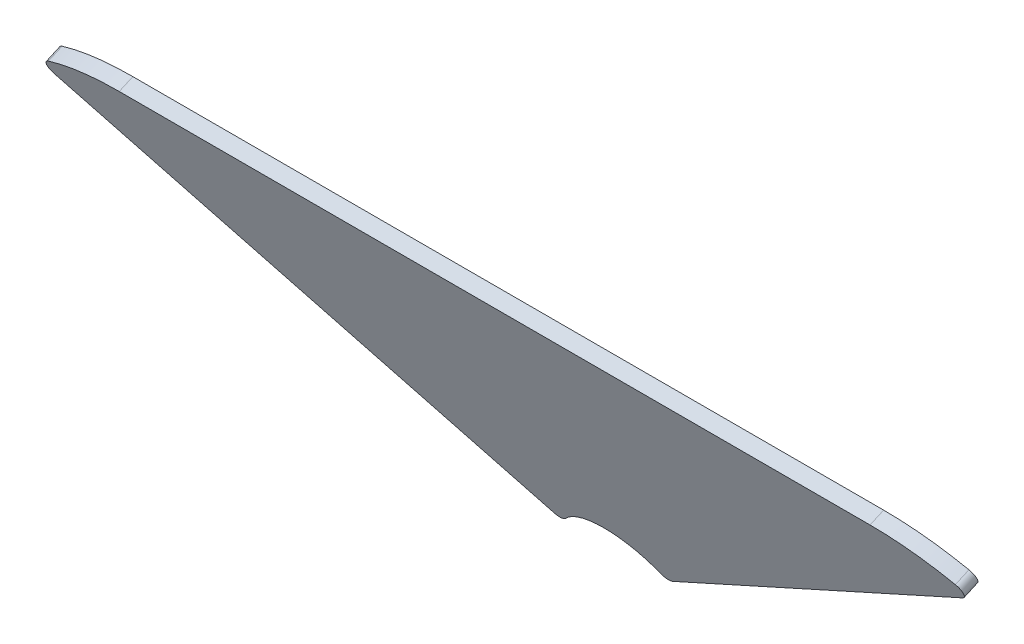
ISO-10303-21;
HEADER;
FILE_DESCRIPTION(('STEP AP214'),'2;1');
FILE_NAME('part.step','',(''),(''),'','','');
FILE_SCHEMA(('AUTOMOTIVE_DESIGN { 1 0 10303 214 1 1 1 1 }'));
ENDSEC;
DATA;
#1=APPLICATION_CONTEXT('core data for automotive mechanical design processes');
#2=APPLICATION_PROTOCOL_DEFINITION('international standard','automotive_design',2000,#1);
#3=PRODUCT_CONTEXT('',#1,'mechanical');
#4=PRODUCT('Part','Part','',(#3));
#5=PRODUCT_RELATED_PRODUCT_CATEGORY('part','',(#4));
#6=PRODUCT_DEFINITION_FORMATION('','',#4);
#7=PRODUCT_DEFINITION_CONTEXT('part definition',#1,'design');
#8=PRODUCT_DEFINITION('design','',#6,#7);
#9=PRODUCT_DEFINITION_SHAPE('','',#8);
#10=(LENGTH_UNIT() NAMED_UNIT(*) SI_UNIT(.MILLI.,.METRE.));
#11=(NAMED_UNIT(*) PLANE_ANGLE_UNIT() SI_UNIT($,.RADIAN.));
#12=(NAMED_UNIT(*) SI_UNIT($,.STERADIAN.) SOLID_ANGLE_UNIT());
#13=UNCERTAINTY_MEASURE_WITH_UNIT(LENGTH_MEASURE(1.E-05),#10,'distance_accuracy_value','');
#14=(GEOMETRIC_REPRESENTATION_CONTEXT(3) GLOBAL_UNCERTAINTY_ASSIGNED_CONTEXT((#13)) GLOBAL_UNIT_ASSIGNED_CONTEXT((#10,
#11,#12)) REPRESENTATION_CONTEXT('',''));
#15=CARTESIAN_POINT('',(0.,0.,0.));
#16=DIRECTION('',(0.,0.,1.));
#17=DIRECTION('',(1.,0.,0.));
#18=AXIS2_PLACEMENT_3D('',#15,#16,#17);
#19=CARTESIAN_POINT('',(648.976759705314,817.463497919613,1215.15601855206));
#20=DIRECTION('',(0.,-0.407574775249865,0.913171836282757));
#21=DIRECTION('',(0.,-0.913171836282757,-0.407574775249865));
#22=AXIS2_PLACEMENT_3D('',#19,#20,#21);
#23=CYLINDRICAL_SURFACE('',#22,26.5523634746972);
#24=CARTESIAN_POINT('',(648.976759705314,817.463497919613,1215.15601855206));
#25=DIRECTION('',(0.,-0.407574775249865,0.913171836282757));
#26=DIRECTION('',(0.,0.913171836282757,0.407574775249865));
#27=AXIS2_PLACEMENT_3D('',#24,#25,#26);
#28=CIRCLE('',#27,26.5523634746972);
#29=CARTESIAN_POINT('',(669.202994390904,833.172374395633,1222.16734056699));
#30=VERTEX_POINT('',#29);
#31=CARTESIAN_POINT('',(628.750535488322,833.172385635552,1222.16734558369));
#32=VERTEX_POINT('',#31);
#33=EDGE_CURVE('E176',#30,#32,#28,.T.);
#34=ORIENTED_EDGE('',*,*,#33,.F.);
#35=DIRECTION('',(0.,-0.407574775249865,0.913171836282757));
#36=VECTOR('',#35,1.);
#37=CARTESIAN_POINT('',(669.202994390904,833.172374395633,1222.16734056699));
#38=LINE('',#37,#36);
#39=CARTESIAN_POINT('',(669.202994390904,830.584274572796,1227.96598172738));
#40=VERTEX_POINT('',#39);
#41=EDGE_CURVE('E181',#30,#40,#38,.T.);
#42=ORIENTED_EDGE('',*,*,#41,.T.);
#43=CARTESIAN_POINT('',(648.976759705314,814.875398096777,1220.95465971245));
#44=DIRECTION('',(0.,-0.407574775249865,0.913171836282757));
#45=DIRECTION('',(0.,0.913171836282757,0.407574775249865));
#46=AXIS2_PLACEMENT_3D('',#43,#44,#45);
#47=CIRCLE('',#46,26.5523634746972);
#48=CARTESIAN_POINT('',(628.750535488322,830.584285812715,1227.96598674408));
#49=VERTEX_POINT('',#48);
#50=EDGE_CURVE('E156',#40,#49,#47,.T.);
#51=ORIENTED_EDGE('',*,*,#50,.T.);
#52=DIRECTION('',(0.,-0.407574775249865,0.913171836282757));
#53=VECTOR('',#52,1.);
#54=CARTESIAN_POINT('',(628.750535488322,833.172385635552,1222.16734558369));
#55=LINE('',#54,#53);
#56=EDGE_CURVE('E141',#49,#32,#55,.F.);
#57=ORIENTED_EDGE('',*,*,#56,.T.);
#58=EDGE_LOOP('',(#34,#42,#51,#57));
#59=FACE_BOUND('',#58,.T.);
#60=ADVANCED_FACE('F44',(#59),#23,.F.);
#61=CARTESIAN_POINT('',(462.372119344804,928.855167936901,1264.87331497769));
#62=DIRECTION('',(0.547162835676885,0.764348736670399,0.341150758469618));
#63=DIRECTION('',(-0.813129518351622,0.582082800282966,0.));
#64=AXIS2_PLACEMENT_3D('',#61,#62,#63);
#65=PLANE('',#64);
#66=DIRECTION('',(-0.83702618313529,0.49965369140074,0.223009769776085));
#67=VECTOR('',#66,1.);
#68=CARTESIAN_POINT('',(626.751764414209,830.730523684528,1221.07747257585));
#69=LINE('',#68,#67);
#70=CARTESIAN_POINT('',(623.763583131698,832.514286054767,1221.87361687013));
#71=VERTEX_POINT('',#70);
#72=CARTESIAN_POINT('',(455.1698421272,933.154489117976,1266.79222530155));
#73=VERTEX_POINT('',#72);
#74=EDGE_CURVE('E131',#71,#73,#69,.T.);
#75=ORIENTED_EDGE('',*,*,#74,.F.);
#76=DIRECTION('',(0.,-0.407574775249865,0.913171836282757));
#77=VECTOR('',#76,1.);
#78=CARTESIAN_POINT('',(623.763583131698,832.514286054767,1221.87361687013));
#79=LINE('',#78,#77);
#80=CARTESIAN_POINT('',(623.763583131698,829.92618623193,1227.67225803052));
#81=VERTEX_POINT('',#80);
#82=EDGE_CURVE('E218',#71,#81,#79,.T.);
#83=ORIENTED_EDGE('',*,*,#82,.T.);
#84=DIRECTION('',(-0.837026183135289,0.499653691400742,0.223009769776083));
#85=VECTOR('',#84,1.);
#86=CARTESIAN_POINT('',(462.372119344804,926.267068114065,1270.67195613808));
#87=LINE('',#86,#85);
#88=CARTESIAN_POINT('',(455.1698421272,930.566389295139,1272.59086646194));
#89=VERTEX_POINT('',#88);
#90=EDGE_CURVE('E160',#81,#89,#87,.T.);
#91=ORIENTED_EDGE('',*,*,#90,.T.);
#92=DIRECTION('',(0.,-0.407574775249865,0.913171836282757));
#93=VECTOR('',#92,1.);
#94=CARTESIAN_POINT('',(455.1698421272,933.154489117976,1266.79222530155));
#95=LINE('',#94,#93);
#96=EDGE_CURVE('E215',#89,#73,#95,.F.);
#97=ORIENTED_EDGE('',*,*,#96,.T.);
#98=EDGE_LOOP('',(#75,#83,#91,#97));
#99=FACE_BOUND('',#98,.T.);
#100=ADVANCED_FACE('F254',(#99),#65,.F.);
#101=CARTESIAN_POINT('',(488.877633309184,876.219137175357,1241.38034513861));
#102=DIRECTION('',(0.,-0.407574775249865,0.913171836282757));
#103=DIRECTION('',(0.,-0.913171836282757,-0.407574775249865));
#104=AXIS2_PLACEMENT_3D('',#101,#102,#103);
#105=CYLINDRICAL_SURFACE('',#104,76.5785320140082);
#106=CARTESIAN_POINT('',(488.877633309184,876.219137175357,1241.38034513861));
#107=DIRECTION('',(0.,0.407574775249865,-0.913171836282757));
#108=DIRECTION('',(0.,-0.913171836282757,-0.407574775249865));
#109=AXIS2_PLACEMENT_3D('',#106,#107,#108);
#110=CIRCLE('',#109,76.5785320140082);
#111=CARTESIAN_POINT('',(455.598816651891,939.200142118402,1269.49057359152));
#112=VERTEX_POINT('',#111);
#113=CARTESIAN_POINT('',(488.877633309184,946.148495874427,1272.59182311319));
#114=VERTEX_POINT('',#113);
#115=EDGE_CURVE('E120',#112,#114,#110,.T.);
#116=ORIENTED_EDGE('',*,*,#115,.F.);
#117=DIRECTION('',(0.,-0.407574775249865,0.913171836282757));
#118=VECTOR('',#117,1.);
#119=CARTESIAN_POINT('',(455.598816651891,939.200142118402,1269.49057359152));
#120=LINE('',#119,#118);
#121=CARTESIAN_POINT('',(455.598816651891,936.612042295566,1275.28921475192));
#122=VERTEX_POINT('',#121);
#123=EDGE_CURVE('E53',#112,#122,#120,.T.);
#124=ORIENTED_EDGE('',*,*,#123,.T.);
#125=CARTESIAN_POINT('',(488.877633309184,873.63103735252,1247.17898629901));
#126=DIRECTION('',(0.,0.407574775249865,-0.913171836282757));
#127=DIRECTION('',(0.,-0.913171836282757,-0.407574775249865));
#128=AXIS2_PLACEMENT_3D('',#125,#126,#127);
#129=CIRCLE('',#128,76.5785320140082);
#130=CARTESIAN_POINT('',(488.877633309184,943.56039605159,1278.39046427358));
#131=VERTEX_POINT('',#130);
#132=EDGE_CURVE('E137',#122,#131,#129,.T.);
#133=ORIENTED_EDGE('',*,*,#132,.T.);
#134=DIRECTION('',(0.,-0.407574775249865,0.913171836282757));
#135=VECTOR('',#134,1.);
#136=CARTESIAN_POINT('',(488.877633309184,946.148495874427,1272.59182311319));
#137=LINE('',#136,#135);
#138=EDGE_CURVE('E134',#114,#131,#137,.T.);
#139=ORIENTED_EDGE('',*,*,#138,.F.);
#140=EDGE_LOOP('',(#116,#124,#133,#139));
#141=FACE_BOUND('',#140,.T.);
#142=ADVANCED_FACE('F135',(#141),#105,.T.);
#143=CARTESIAN_POINT('',(488.877633309184,946.148495874427,1272.59182311319));
#144=DIRECTION('',(0.,-0.913171836282757,-0.407574775249865));
#145=DIRECTION('',(0.,0.407574775249865,-0.913171836282757));
#146=AXIS2_PLACEMENT_3D('',#143,#144,#145);
#147=PLANE('',#146);
#148=DIRECTION('',(1.,0.,0.));
#149=VECTOR('',#148,1.);
#150=CARTESIAN_POINT('',(488.877633309184,943.56039605159,1278.39046427358));
#151=LINE('',#150,#149);
#152=CARTESIAN_POINT('',(809.076030052897,943.56039605159,1278.39046427358));
#153=VERTEX_POINT('',#152);
#154=EDGE_CURVE('E166',#131,#153,#151,.T.);
#155=ORIENTED_EDGE('',*,*,#154,.T.);
#156=DIRECTION('',(0.,-0.407574775249865,0.913171836282757));
#157=VECTOR('',#156,1.);
#158=CARTESIAN_POINT('',(809.076030052897,946.148495874427,1272.59182311319));
#159=LINE('',#158,#157);
#160=CARTESIAN_POINT('',(809.076030052897,946.148495874427,1272.59182311319));
#161=VERTEX_POINT('',#160);
#162=EDGE_CURVE('E142',#161,#153,#159,.T.);
#163=ORIENTED_EDGE('',*,*,#162,.F.);
#164=DIRECTION('',(1.,0.,0.));
#165=VECTOR('',#164,1.);
#166=CARTESIAN_POINT('',(488.877633309184,946.148495874427,1272.59182311319));
#167=LINE('',#166,#165);
#168=EDGE_CURVE('E125',#114,#161,#167,.T.);
#169=ORIENTED_EDGE('',*,*,#168,.F.);
#170=ORIENTED_EDGE('',*,*,#138,.T.);
#171=EDGE_LOOP('',(#155,#163,#169,#170));
#172=FACE_BOUND('',#171,.T.);
#173=ADVANCED_FACE('F144',(#172),#147,.F.);
#174=CARTESIAN_POINT('',(809.076030052897,876.217572779631,1241.37964690394));
#175=DIRECTION('',(0.,-0.407574775249865,0.913171836282757));
#176=DIRECTION('',(0.,-0.913171836282757,-0.407574775249865));
#177=AXIS2_PLACEMENT_3D('',#174,#175,#176);
#178=CYLINDRICAL_SURFACE('',#177,76.5802451589646);
#179=CARTESIAN_POINT('',(809.076030052897,873.629472956795,1247.17828806434));
#180=DIRECTION('',(0.,0.407574775249865,-0.913171836282757));
#181=DIRECTION('',(0.,0.913171836282757,0.407574775249865));
#182=AXIS2_PLACEMENT_3D('',#179,#180,#181);
#183=CIRCLE('',#182,76.5802451589646);
#184=CARTESIAN_POINT('',(842.354985766223,936.612153613154,1275.28926443615));
#185=VERTEX_POINT('',#184);
#186=EDGE_CURVE('E169',#153,#185,#183,.T.);
#187=ORIENTED_EDGE('',*,*,#186,.T.);
#188=DIRECTION('',(0.,-0.407574775249865,0.913171836282757));
#189=VECTOR('',#188,1.);
#190=CARTESIAN_POINT('',(842.354985766223,939.200253435991,1269.49062327576));
#191=LINE('',#190,#189);
#192=CARTESIAN_POINT('',(842.354985766223,939.200253435991,1269.49062327576));
#193=VERTEX_POINT('',#192);
#194=EDGE_CURVE('E11',#185,#193,#191,.F.);
#195=ORIENTED_EDGE('',*,*,#194,.T.);
#196=CARTESIAN_POINT('',(809.076030052897,876.217572779631,1241.37964690394));
#197=DIRECTION('',(0.,0.407574775249865,-0.913171836282757));
#198=DIRECTION('',(0.,0.913171836282757,0.407574775249865));
#199=AXIS2_PLACEMENT_3D('',#196,#197,#198);
#200=CIRCLE('',#199,76.5802451589646);
#201=EDGE_CURVE('E147',#161,#193,#200,.T.);
#202=ORIENTED_EDGE('',*,*,#201,.F.);
#203=ORIENTED_EDGE('',*,*,#162,.T.);
#204=EDGE_LOOP('',(#187,#195,#202,#203));
#205=FACE_BOUND('',#204,.T.);
#206=ADVANCED_FACE('F228',(#205),#178,.T.);
#207=CARTESIAN_POINT('',(671.201764414207,830.730510528575,1221.07746670397));
#208=DIRECTION('',(-0.547162573327616,0.764348893276893,0.341150828367586));
#209=DIRECTION('',(-0.813129706896313,-0.582082536898948,0.));
#210=AXIS2_PLACEMENT_3D('',#207,#208,#209);
#211=PLANE('',#210);
#212=DIRECTION('',(-0.837026354632577,-0.499653451830778,-0.223009662849142));
#213=VECTOR('',#212,1.);
#214=CARTESIAN_POINT('',(671.201764414207,828.142410705738,1226.87610786437));
#215=LINE('',#214,#213);
#216=CARTESIAN_POINT('',(842.783989412419,930.566486744294,1272.5909099563));
#217=VERTEX_POINT('',#216);
#218=CARTESIAN_POINT('',(674.189947250117,829.926172782524,1227.67225202767));
#219=VERTEX_POINT('',#218);
#220=EDGE_CURVE('E172',#217,#219,#215,.T.);
#221=ORIENTED_EDGE('',*,*,#220,.T.);
#222=DIRECTION('',(0.,-0.407574775249865,0.913171836282757));
#223=VECTOR('',#222,1.);
#224=CARTESIAN_POINT('',(674.189947250117,832.514272605361,1221.87361086727));
#225=LINE('',#224,#223);
#226=CARTESIAN_POINT('',(674.189947250117,832.514272605361,1221.87361086727));
#227=VERTEX_POINT('',#226);
#228=EDGE_CURVE('E201',#219,#227,#225,.F.);
#229=ORIENTED_EDGE('',*,*,#228,.T.);
#230=DIRECTION('',(-0.837026354632577,-0.499653451830779,-0.223009662849141));
#231=VECTOR('',#230,1.);
#232=CARTESIAN_POINT('',(835.581668577875,928.855242291701,1264.87334816437));
#233=LINE('',#232,#231);
#234=CARTESIAN_POINT('',(842.783989412419,933.15458656713,1266.7922687959));
#235=VERTEX_POINT('',#234);
#236=EDGE_CURVE('E150',#235,#227,#233,.T.);
#237=ORIENTED_EDGE('',*,*,#236,.F.);
#238=DIRECTION('',(0.,-0.407574775249865,0.913171836282757));
#239=VECTOR('',#238,1.);
#240=CARTESIAN_POINT('',(842.783989412419,933.15458656713,1266.7922687959));
#241=LINE('',#240,#239);
#242=EDGE_CURVE('E197',#235,#217,#241,.T.);
#243=ORIENTED_EDGE('',*,*,#242,.T.);
#244=EDGE_LOOP('',(#221,#229,#237,#243));
#245=FACE_BOUND('',#244,.T.);
#246=ADVANCED_FACE('F235',(#245),#211,.F.);
#247=CARTESIAN_POINT('',(648.976759705314,817.463497919613,1215.15601855206));
#248=DIRECTION('',(0.,0.407574775249865,-0.913171836282757));
#249=DIRECTION('',(0.,0.913171836282757,0.407574775249865));
#250=AXIS2_PLACEMENT_3D('',#247,#248,#249);
#251=PLANE('',#250);
#252=ORIENTED_EDGE('',*,*,#236,.T.);
#253=CARTESIAN_POINT('',(672.105257845739,835.426441888746,1223.17339552335));
#254=DIRECTION('',(0.,0.407574775249865,-0.913171836282757));
#255=DIRECTION('',(0.,0.913171836282757,0.407574775249865));
#256=AXIS2_PLACEMENT_3D('',#253,#254,#255);
#257=CIRCLE('',#256,3.81);
#258=EDGE_CURVE('E212',#227,#30,#257,.T.);
#259=ORIENTED_EDGE('',*,*,#258,.T.);
#260=ORIENTED_EDGE('',*,*,#33,.T.);
#261=CARTESIAN_POINT('',(625.848273535627,835.426454741481,1223.1734012599));
#262=DIRECTION('',(0.,0.407574775249865,-0.913171836282757));
#263=DIRECTION('',(0.,0.913171836282757,0.407574775249865));
#264=AXIS2_PLACEMENT_3D('',#261,#262,#263);
#265=CIRCLE('',#264,3.81);
#266=EDGE_CURVE('E209',#32,#71,#265,.T.);
#267=ORIENTED_EDGE('',*,*,#266,.T.);
#268=ORIENTED_EDGE('',*,*,#74,.T.);
#269=CARTESIAN_POINT('',(457.254532531128,936.06665780469,1268.09200969132));
#270=DIRECTION('',(0.,0.407574775249865,-0.913171836282757));
#271=DIRECTION('',(0.,0.913171836282757,0.407574775249865));
#272=AXIS2_PLACEMENT_3D('',#269,#270,#271);
#273=CIRCLE('',#272,3.81);
#274=EDGE_CURVE('E66',#73,#112,#273,.T.);
#275=ORIENTED_EDGE('',*,*,#274,.T.);
#276=ORIENTED_EDGE('',*,*,#115,.T.);
#277=ORIENTED_EDGE('',*,*,#168,.T.);
#278=ORIENTED_EDGE('',*,*,#201,.T.);
#279=CARTESIAN_POINT('',(840.699300008041,936.066755850516,1268.09205345198));
#280=DIRECTION('',(0.,0.407574775249865,-0.913171836282757));
#281=DIRECTION('',(0.,0.913171836282757,0.407574775249865));
#282=AXIS2_PLACEMENT_3D('',#279,#280,#281);
#283=CIRCLE('',#282,3.81);
#284=EDGE_CURVE('E204',#193,#235,#283,.T.);
#285=ORIENTED_EDGE('',*,*,#284,.T.);
#286=EDGE_LOOP('',(#252,#259,#260,#267,#268,#275,#276,#277,#278,#285));
#287=FACE_BOUND('',#286,.T.);
#288=ADVANCED_FACE('F123',(#287),#251,.T.);
#289=CARTESIAN_POINT('',(648.976759705314,814.875398096777,1220.95465971245));
#290=DIRECTION('',(0.,0.407574775249865,-0.913171836282757));
#291=DIRECTION('',(0.,0.913171836282757,0.407574775249865));
#292=AXIS2_PLACEMENT_3D('',#289,#290,#291);
#293=PLANE('',#292);
#294=ORIENTED_EDGE('',*,*,#50,.F.);
#295=CARTESIAN_POINT('',(672.105257845739,832.838342065909,1228.97203668375));
#296=DIRECTION('',(0.,0.407574775249865,-0.913171836282757));
#297=DIRECTION('',(0.,0.913171836282757,0.407574775249865));
#298=AXIS2_PLACEMENT_3D('',#295,#296,#297);
#299=CIRCLE('',#298,3.81);
#300=EDGE_CURVE('E194',#40,#219,#299,.F.);
#301=ORIENTED_EDGE('',*,*,#300,.T.);
#302=ORIENTED_EDGE('',*,*,#220,.F.);
#303=CARTESIAN_POINT('',(840.699300008041,933.478656027679,1273.89069461238));
#304=DIRECTION('',(0.,0.407574775249865,-0.913171836282757));
#305=DIRECTION('',(0.,0.913171836282757,0.407574775249865));
#306=AXIS2_PLACEMENT_3D('',#303,#304,#305);
#307=CIRCLE('',#306,3.81);
#308=EDGE_CURVE('E185',#217,#185,#307,.F.);
#309=ORIENTED_EDGE('',*,*,#308,.T.);
#310=ORIENTED_EDGE('',*,*,#186,.F.);
#311=ORIENTED_EDGE('',*,*,#154,.F.);
#312=ORIENTED_EDGE('',*,*,#132,.F.);
#313=CARTESIAN_POINT('',(457.254532531128,933.478557981853,1273.89065085171));
#314=DIRECTION('',(0.,0.407574775249865,-0.913171836282757));
#315=DIRECTION('',(0.,0.913171836282757,0.407574775249865));
#316=AXIS2_PLACEMENT_3D('',#313,#314,#315);
#317=CIRCLE('',#316,3.81);
#318=EDGE_CURVE('E188',#122,#89,#317,.F.);
#319=ORIENTED_EDGE('',*,*,#318,.T.);
#320=ORIENTED_EDGE('',*,*,#90,.F.);
#321=CARTESIAN_POINT('',(625.848273535627,832.838354918645,1228.97204242029));
#322=DIRECTION('',(0.,0.407574775249865,-0.913171836282757));
#323=DIRECTION('',(0.,0.913171836282757,0.407574775249865));
#324=AXIS2_PLACEMENT_3D('',#321,#322,#323);
#325=CIRCLE('',#324,3.81);
#326=EDGE_CURVE('E191',#81,#49,#325,.F.);
#327=ORIENTED_EDGE('',*,*,#326,.T.);
#328=EDGE_LOOP('',(#294,#301,#302,#309,#310,#311,#312,#319,#320,#327));
#329=FACE_BOUND('',#328,.T.);
#330=ADVANCED_FACE('F225',(#329),#293,.F.);
#331=CARTESIAN_POINT('',(672.105257845739,835.426441888746,1223.17339552335));
#332=DIRECTION('',(0.,-0.407574775249865,0.913171836282757));
#333=DIRECTION('',(0.,-0.913171836282757,-0.407574775249865));
#334=AXIS2_PLACEMENT_3D('',#331,#332,#333);
#335=CYLINDRICAL_SURFACE('',#334,3.81);
#336=ORIENTED_EDGE('',*,*,#258,.F.);
#337=ORIENTED_EDGE('',*,*,#228,.F.);
#338=ORIENTED_EDGE('',*,*,#300,.F.);
#339=ORIENTED_EDGE('',*,*,#41,.F.);
#340=EDGE_LOOP('',(#336,#337,#338,#339));
#341=FACE_BOUND('',#340,.T.);
#342=ADVANCED_FACE('F240',(#341),#335,.T.);
#343=CARTESIAN_POINT('',(625.848273535627,835.426454741481,1223.1734012599));
#344=DIRECTION('',(0.,-0.407574775249865,0.913171836282757));
#345=DIRECTION('',(0.,-0.913171836282757,-0.407574775249865));
#346=AXIS2_PLACEMENT_3D('',#343,#344,#345);
#347=CYLINDRICAL_SURFACE('',#346,3.81);
#348=ORIENTED_EDGE('',*,*,#266,.F.);
#349=ORIENTED_EDGE('',*,*,#56,.F.);
#350=ORIENTED_EDGE('',*,*,#326,.F.);
#351=ORIENTED_EDGE('',*,*,#82,.F.);
#352=EDGE_LOOP('',(#348,#349,#350,#351));
#353=FACE_BOUND('',#352,.T.);
#354=ADVANCED_FACE('F256',(#353),#347,.T.);
#355=CARTESIAN_POINT('',(457.254532531128,936.06665780469,1268.09200969132));
#356=DIRECTION('',(0.,-0.407574775249865,0.913171836282757));
#357=DIRECTION('',(0.,-0.913171836282757,-0.407574775249865));
#358=AXIS2_PLACEMENT_3D('',#355,#356,#357);
#359=CYLINDRICAL_SURFACE('',#358,3.81);
#360=ORIENTED_EDGE('',*,*,#274,.F.);
#361=ORIENTED_EDGE('',*,*,#96,.F.);
#362=ORIENTED_EDGE('',*,*,#318,.F.);
#363=ORIENTED_EDGE('',*,*,#123,.F.);
#364=EDGE_LOOP('',(#360,#361,#362,#363));
#365=FACE_BOUND('',#364,.T.);
#366=ADVANCED_FACE('F253',(#365),#359,.T.);
#367=CARTESIAN_POINT('',(840.699300008041,936.066755850515,1268.09205345198));
#368=DIRECTION('',(0.,-0.407574775249865,0.913171836282757));
#369=DIRECTION('',(0.,-0.913171836282757,-0.407574775249865));
#370=AXIS2_PLACEMENT_3D('',#367,#368,#369);
#371=CYLINDRICAL_SURFACE('',#370,3.81);
#372=ORIENTED_EDGE('',*,*,#284,.F.);
#373=ORIENTED_EDGE('',*,*,#194,.F.);
#374=ORIENTED_EDGE('',*,*,#308,.F.);
#375=ORIENTED_EDGE('',*,*,#242,.F.);
#376=EDGE_LOOP('',(#372,#373,#374,#375));
#377=FACE_BOUND('',#376,.T.);
#378=ADVANCED_FACE('F46',(#377),#371,.T.);
#379=CLOSED_SHELL('',(#60,#100,#142,#173,#206,#246,#288,#330,#342,#354,#366,#378));
#380=MANIFOLD_SOLID_BREP('B2',#379);
#381=ADVANCED_BREP_SHAPE_REPRESENTATION('',(#18,#380),#14);
#382=SHAPE_DEFINITION_REPRESENTATION(#9,#381);
ENDSEC;
END-ISO-10303-21;
